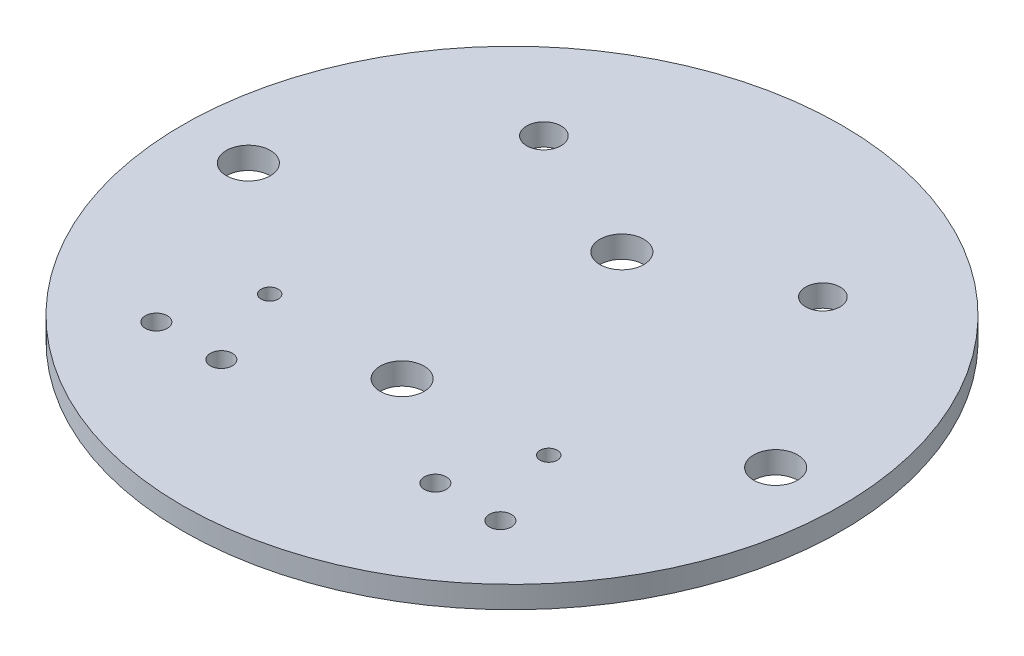
ISO-10303-21;
HEADER;
FILE_DESCRIPTION(('STEP AP214'),'2;1');
FILE_NAME('part.step','',(''),(''),'','','');
FILE_SCHEMA(('AUTOMOTIVE_DESIGN { 1 0 10303 214 1 1 1 1 }'));
ENDSEC;
DATA;
#1=APPLICATION_CONTEXT('core data for automotive mechanical design processes');
#2=APPLICATION_PROTOCOL_DEFINITION('international standard','automotive_design',2000,#1);
#3=PRODUCT_CONTEXT('',#1,'mechanical');
#4=PRODUCT('Part','Part','',(#3));
#5=PRODUCT_RELATED_PRODUCT_CATEGORY('part','',(#4));
#6=PRODUCT_DEFINITION_FORMATION('','',#4);
#7=PRODUCT_DEFINITION_CONTEXT('part definition',#1,'design');
#8=PRODUCT_DEFINITION('design','',#6,#7);
#9=PRODUCT_DEFINITION_SHAPE('','',#8);
#10=(LENGTH_UNIT() NAMED_UNIT(*) SI_UNIT(.MILLI.,.METRE.));
#11=(NAMED_UNIT(*) PLANE_ANGLE_UNIT() SI_UNIT($,.RADIAN.));
#12=(NAMED_UNIT(*) SI_UNIT($,.STERADIAN.) SOLID_ANGLE_UNIT());
#13=UNCERTAINTY_MEASURE_WITH_UNIT(LENGTH_MEASURE(1.E-05),#10,'distance_accuracy_value','');
#14=(GEOMETRIC_REPRESENTATION_CONTEXT(3) GLOBAL_UNCERTAINTY_ASSIGNED_CONTEXT((#13)) GLOBAL_UNIT_ASSIGNED_CONTEXT((#10,
#11,#12)) REPRESENTATION_CONTEXT('',''));
#15=CARTESIAN_POINT('',(0.,0.,0.));
#16=DIRECTION('',(0.,0.,1.));
#17=DIRECTION('',(1.,0.,0.));
#18=AXIS2_PLACEMENT_3D('',#15,#16,#17);
#19=CARTESIAN_POINT('',(0.,3.175,0.));
#20=DIRECTION('',(0.,-1.,0.));
#21=DIRECTION('',(0.,0.,-1.));
#22=AXIS2_PLACEMENT_3D('',#19,#20,#21);
#23=CYLINDRICAL_SURFACE('',#22,47.625);
#24=CARTESIAN_POINT('',(0.,3.175,0.));
#25=DIRECTION('',(0.,1.,0.));
#26=DIRECTION('',(0.,0.,1.));
#27=AXIS2_PLACEMENT_3D('',#24,#25,#26);
#28=CIRCLE('',#27,47.625);
#29=CARTESIAN_POINT('',(0.,3.175,47.625));
#30=VERTEX_POINT('',#29);
#31=EDGE_CURVE('E10',#30,#30,#28,.T.);
#32=ORIENTED_EDGE('',*,*,#31,.F.);
#33=EDGE_LOOP('',(#32));
#34=FACE_BOUND('',#33,.T.);
#35=CARTESIAN_POINT('',(0.,0.,0.));
#36=DIRECTION('',(0.,1.,0.));
#37=DIRECTION('',(0.,0.,1.));
#38=AXIS2_PLACEMENT_3D('',#35,#36,#37);
#39=CIRCLE('',#38,47.625);
#40=CARTESIAN_POINT('',(0.,0.,47.625));
#41=VERTEX_POINT('',#40);
#42=EDGE_CURVE('E37',#41,#41,#39,.T.);
#43=ORIENTED_EDGE('',*,*,#42,.T.);
#44=EDGE_LOOP('',(#43));
#45=FACE_BOUND('',#44,.T.);
#46=ADVANCED_FACE('F30',(#34,#45),#23,.T.);
#47=CARTESIAN_POINT('',(0.,3.175,0.));
#48=DIRECTION('',(0.,1.,0.));
#49=DIRECTION('',(0.,0.,1.));
#50=AXIS2_PLACEMENT_3D('',#47,#48,#49);
#51=PLANE('',#50);
#52=CARTESIAN_POINT('',(-20.16125,3.175,-24.765));
#53=DIRECTION('',(0.,1.,0.));
#54=DIRECTION('',(0.,0.,1.));
#55=AXIS2_PLACEMENT_3D('',#52,#53,#54);
#56=CIRCLE('',#55,2.4892);
#57=CARTESIAN_POINT('',(-20.16125,3.175,-22.2758));
#58=VERTEX_POINT('',#57);
#59=EDGE_CURVE('E87',#58,#58,#56,.T.);
#60=ORIENTED_EDGE('',*,*,#59,.F.);
#61=EDGE_LOOP('',(#60));
#62=FACE_BOUND('',#61,.T.);
#63=CARTESIAN_POINT('',(20.16125,3.175,-24.765));
#64=DIRECTION('',(0.,1.,0.));
#65=DIRECTION('',(0.,0.,1.));
#66=AXIS2_PLACEMENT_3D('',#63,#64,#65);
#67=CIRCLE('',#66,2.4892);
#68=CARTESIAN_POINT('',(20.16125,3.175,-22.2758));
#69=VERTEX_POINT('',#68);
#70=EDGE_CURVE('E92',#69,#69,#67,.T.);
#71=ORIENTED_EDGE('',*,*,#70,.F.);
#72=EDGE_LOOP('',(#71));
#73=FACE_BOUND('',#72,.T.);
#74=CARTESIAN_POINT('',(-24.86025,3.175,26.5429999999999));
#75=DIRECTION('',(0.,1.,0.));
#76=DIRECTION('',(0.,0.,1.));
#77=AXIS2_PLACEMENT_3D('',#74,#75,#76);
#78=CIRCLE('',#77,1.5875);
#79=CARTESIAN_POINT('',(-24.86025,3.175,28.1304999999999));
#80=VERTEX_POINT('',#79);
#81=EDGE_CURVE('E59',#80,#80,#78,.T.);
#82=ORIENTED_EDGE('',*,*,#81,.F.);
#83=EDGE_LOOP('',(#82));
#84=FACE_BOUND('',#83,.T.);
#85=CARTESIAN_POINT('',(-15.46225,3.175,26.5429999999999));
#86=DIRECTION('',(0.,1.,0.));
#87=DIRECTION('',(0.,0.,1.));
#88=AXIS2_PLACEMENT_3D('',#85,#86,#87);
#89=CIRCLE('',#88,1.5875);
#90=CARTESIAN_POINT('',(-15.46225,3.175,28.1304999999999));
#91=VERTEX_POINT('',#90);
#92=EDGE_CURVE('E82',#91,#91,#89,.T.);
#93=ORIENTED_EDGE('',*,*,#92,.F.);
#94=EDGE_LOOP('',(#93));
#95=FACE_BOUND('',#94,.T.);
#96=CARTESIAN_POINT('',(15.46225,3.175,26.5429999999999));
#97=DIRECTION('',(0.,1.,0.));
#98=DIRECTION('',(0.,0.,1.));
#99=AXIS2_PLACEMENT_3D('',#96,#97,#98);
#100=CIRCLE('',#99,1.5875);
#101=CARTESIAN_POINT('',(15.46225,3.175,28.1304999999999));
#102=VERTEX_POINT('',#101);
#103=EDGE_CURVE('E78',#102,#102,#100,.T.);
#104=ORIENTED_EDGE('',*,*,#103,.F.);
#105=EDGE_LOOP('',(#104));
#106=FACE_BOUND('',#105,.T.);
#107=CARTESIAN_POINT('',(24.86025,3.175,26.5429999999999));
#108=DIRECTION('',(0.,1.,0.));
#109=DIRECTION('',(0.,0.,1.));
#110=AXIS2_PLACEMENT_3D('',#107,#108,#109);
#111=CIRCLE('',#110,1.5875);
#112=CARTESIAN_POINT('',(24.86025,3.175,28.1304999999999));
#113=VERTEX_POINT('',#112);
#114=EDGE_CURVE('E74',#113,#113,#111,.T.);
#115=ORIENTED_EDGE('',*,*,#114,.F.);
#116=EDGE_LOOP('',(#115));
#117=FACE_BOUND('',#116,.T.);
#118=CARTESIAN_POINT('',(20.16125,3.175,14.859));
#119=DIRECTION('',(0.,1.,0.));
#120=DIRECTION('',(0.,0.,1.));
#121=AXIS2_PLACEMENT_3D('',#118,#119,#120);
#122=CIRCLE('',#121,1.25);
#123=CARTESIAN_POINT('',(20.16125,3.175,16.109));
#124=VERTEX_POINT('',#123);
#125=EDGE_CURVE('E70',#124,#124,#122,.T.);
#126=ORIENTED_EDGE('',*,*,#125,.F.);
#127=EDGE_LOOP('',(#126));
#128=FACE_BOUND('',#127,.T.);
#129=CARTESIAN_POINT('',(-20.16125,3.175,14.8589999999999));
#130=DIRECTION('',(0.,1.,0.));
#131=DIRECTION('',(0.,0.,1.));
#132=AXIS2_PLACEMENT_3D('',#129,#130,#131);
#133=CIRCLE('',#132,1.25);
#134=CARTESIAN_POINT('',(-20.16125,3.175,16.1089999999999));
#135=VERTEX_POINT('',#134);
#136=EDGE_CURVE('E66',#135,#135,#133,.T.);
#137=ORIENTED_EDGE('',*,*,#136,.F.);
#138=EDGE_LOOP('',(#137));
#139=FACE_BOUND('',#138,.T.);
#140=CARTESIAN_POINT('',(0.,3.175,15.875));
#141=DIRECTION('',(0.,1.,0.));
#142=DIRECTION('',(0.,0.,1.));
#143=AXIS2_PLACEMENT_3D('',#140,#141,#142);
#144=CIRCLE('',#143,3.175);
#145=CARTESIAN_POINT('',(0.,3.175,19.05));
#146=VERTEX_POINT('',#145);
#147=EDGE_CURVE('E51',#146,#146,#144,.T.);
#148=ORIENTED_EDGE('',*,*,#147,.F.);
#149=EDGE_LOOP('',(#148));
#150=FACE_BOUND('',#149,.T.);
#151=CARTESIAN_POINT('',(0.,3.175,-15.875));
#152=DIRECTION('',(0.,1.,0.));
#153=DIRECTION('',(0.,0.,1.));
#154=AXIS2_PLACEMENT_3D('',#151,#152,#153);
#155=CIRCLE('',#154,3.175);
#156=CARTESIAN_POINT('',(0.,3.175,-12.7));
#157=VERTEX_POINT('',#156);
#158=EDGE_CURVE('E58',#157,#157,#155,.T.);
#159=ORIENTED_EDGE('',*,*,#158,.F.);
#160=EDGE_LOOP('',(#159));
#161=FACE_BOUND('',#160,.T.);
#162=CARTESIAN_POINT('',(38.1,3.175,0.));
#163=DIRECTION('',(0.,1.,0.));
#164=DIRECTION('',(0.,0.,1.));
#165=AXIS2_PLACEMENT_3D('',#162,#163,#164);
#166=CIRCLE('',#165,3.175);
#167=CARTESIAN_POINT('',(38.1,3.175,3.17499999999998));
#168=VERTEX_POINT('',#167);
#169=EDGE_CURVE('E42',#168,#168,#166,.T.);
#170=ORIENTED_EDGE('',*,*,#169,.F.);
#171=EDGE_LOOP('',(#170));
#172=FACE_BOUND('',#171,.T.);
#173=CARTESIAN_POINT('',(-38.1,3.175,0.));
#174=DIRECTION('',(0.,1.,0.));
#175=DIRECTION('',(0.,0.,1.));
#176=AXIS2_PLACEMENT_3D('',#173,#174,#175);
#177=CIRCLE('',#176,3.175);
#178=CARTESIAN_POINT('',(-38.1,3.175,3.17500000000001));
#179=VERTEX_POINT('',#178);
#180=EDGE_CURVE('E50',#179,#179,#177,.T.);
#181=ORIENTED_EDGE('',*,*,#180,.F.);
#182=EDGE_LOOP('',(#181));
#183=FACE_BOUND('',#182,.T.);
#184=ORIENTED_EDGE('',*,*,#31,.T.);
#185=EDGE_LOOP('',(#184));
#186=FACE_BOUND('',#185,.T.);
#187=ADVANCED_FACE('F120',(#62,#73,#84,#95,#106,#117,#128,#139,#150,#161,#172,#183,#186),#51,.T.);
#188=CARTESIAN_POINT('',(0.,0.,0.));
#189=DIRECTION('',(0.,1.,0.));
#190=DIRECTION('',(0.,0.,1.));
#191=AXIS2_PLACEMENT_3D('',#188,#189,#190);
#192=PLANE('',#191);
#193=CARTESIAN_POINT('',(-20.16125,0.,-24.765));
#194=DIRECTION('',(0.,1.,0.));
#195=DIRECTION('',(0.,0.,1.));
#196=AXIS2_PLACEMENT_3D('',#193,#194,#195);
#197=CIRCLE('',#196,2.4892);
#198=CARTESIAN_POINT('',(-20.16125,0.,-22.2758));
#199=VERTEX_POINT('',#198);
#200=EDGE_CURVE('E33',#199,#199,#197,.T.);
#201=ORIENTED_EDGE('',*,*,#200,.T.);
#202=EDGE_LOOP('',(#201));
#203=FACE_BOUND('',#202,.T.);
#204=CARTESIAN_POINT('',(20.16125,0.,-24.765));
#205=DIRECTION('',(0.,1.,0.));
#206=DIRECTION('',(0.,0.,1.));
#207=AXIS2_PLACEMENT_3D('',#204,#205,#206);
#208=CIRCLE('',#207,2.4892);
#209=CARTESIAN_POINT('',(20.16125,0.,-22.2758));
#210=VERTEX_POINT('',#209);
#211=EDGE_CURVE('E85',#210,#210,#208,.T.);
#212=ORIENTED_EDGE('',*,*,#211,.T.);
#213=EDGE_LOOP('',(#212));
#214=FACE_BOUND('',#213,.T.);
#215=CARTESIAN_POINT('',(-24.86025,0.,26.5429999999999));
#216=DIRECTION('',(0.,1.,0.));
#217=DIRECTION('',(0.,0.,1.));
#218=AXIS2_PLACEMENT_3D('',#215,#216,#217);
#219=CIRCLE('',#218,1.5875);
#220=CARTESIAN_POINT('',(-24.86025,0.,28.1304999999999));
#221=VERTEX_POINT('',#220);
#222=EDGE_CURVE('E83',#221,#221,#219,.T.);
#223=ORIENTED_EDGE('',*,*,#222,.T.);
#224=EDGE_LOOP('',(#223));
#225=FACE_BOUND('',#224,.T.);
#226=CARTESIAN_POINT('',(-15.46225,0.,26.5429999999999));
#227=DIRECTION('',(0.,1.,0.));
#228=DIRECTION('',(0.,0.,1.));
#229=AXIS2_PLACEMENT_3D('',#226,#227,#228);
#230=CIRCLE('',#229,1.5875);
#231=CARTESIAN_POINT('',(-15.46225,0.,28.1304999999999));
#232=VERTEX_POINT('',#231);
#233=EDGE_CURVE('E79',#232,#232,#230,.T.);
#234=ORIENTED_EDGE('',*,*,#233,.T.);
#235=EDGE_LOOP('',(#234));
#236=FACE_BOUND('',#235,.T.);
#237=CARTESIAN_POINT('',(15.46225,0.,26.5429999999999));
#238=DIRECTION('',(0.,1.,0.));
#239=DIRECTION('',(0.,0.,1.));
#240=AXIS2_PLACEMENT_3D('',#237,#238,#239);
#241=CIRCLE('',#240,1.5875);
#242=CARTESIAN_POINT('',(15.46225,0.,28.1304999999999));
#243=VERTEX_POINT('',#242);
#244=EDGE_CURVE('E75',#243,#243,#241,.T.);
#245=ORIENTED_EDGE('',*,*,#244,.T.);
#246=EDGE_LOOP('',(#245));
#247=FACE_BOUND('',#246,.T.);
#248=CARTESIAN_POINT('',(24.86025,0.,26.5429999999999));
#249=DIRECTION('',(0.,1.,0.));
#250=DIRECTION('',(0.,0.,1.));
#251=AXIS2_PLACEMENT_3D('',#248,#249,#250);
#252=CIRCLE('',#251,1.5875);
#253=CARTESIAN_POINT('',(24.86025,0.,28.1304999999999));
#254=VERTEX_POINT('',#253);
#255=EDGE_CURVE('E71',#254,#254,#252,.T.);
#256=ORIENTED_EDGE('',*,*,#255,.T.);
#257=EDGE_LOOP('',(#256));
#258=FACE_BOUND('',#257,.T.);
#259=CARTESIAN_POINT('',(20.16125,0.,14.859));
#260=DIRECTION('',(0.,1.,0.));
#261=DIRECTION('',(0.,0.,1.));
#262=AXIS2_PLACEMENT_3D('',#259,#260,#261);
#263=CIRCLE('',#262,1.25);
#264=CARTESIAN_POINT('',(20.16125,0.,16.109));
#265=VERTEX_POINT('',#264);
#266=EDGE_CURVE('E67',#265,#265,#263,.T.);
#267=ORIENTED_EDGE('',*,*,#266,.T.);
#268=EDGE_LOOP('',(#267));
#269=FACE_BOUND('',#268,.T.);
#270=CARTESIAN_POINT('',(-20.16125,0.,14.8589999999999));
#271=DIRECTION('',(0.,1.,0.));
#272=DIRECTION('',(0.,0.,1.));
#273=AXIS2_PLACEMENT_3D('',#270,#271,#272);
#274=CIRCLE('',#273,1.25);
#275=CARTESIAN_POINT('',(-20.16125,0.,16.1089999999999));
#276=VERTEX_POINT('',#275);
#277=EDGE_CURVE('E63',#276,#276,#274,.T.);
#278=ORIENTED_EDGE('',*,*,#277,.T.);
#279=EDGE_LOOP('',(#278));
#280=FACE_BOUND('',#279,.T.);
#281=CARTESIAN_POINT('',(0.,0.,15.875));
#282=DIRECTION('',(0.,1.,0.));
#283=DIRECTION('',(0.,0.,1.));
#284=AXIS2_PLACEMENT_3D('',#281,#282,#283);
#285=CIRCLE('',#284,3.175);
#286=CARTESIAN_POINT('',(0.,0.,19.05));
#287=VERTEX_POINT('',#286);
#288=EDGE_CURVE('E60',#287,#287,#285,.T.);
#289=ORIENTED_EDGE('',*,*,#288,.T.);
#290=EDGE_LOOP('',(#289));
#291=FACE_BOUND('',#290,.T.);
#292=CARTESIAN_POINT('',(0.,0.,-15.875));
#293=DIRECTION('',(0.,1.,0.));
#294=DIRECTION('',(0.,0.,1.));
#295=AXIS2_PLACEMENT_3D('',#292,#293,#294);
#296=CIRCLE('',#295,3.175);
#297=CARTESIAN_POINT('',(0.,0.,-12.7));
#298=VERTEX_POINT('',#297);
#299=EDGE_CURVE('E55',#298,#298,#296,.T.);
#300=ORIENTED_EDGE('',*,*,#299,.T.);
#301=EDGE_LOOP('',(#300));
#302=FACE_BOUND('',#301,.T.);
#303=CARTESIAN_POINT('',(38.1,0.,0.));
#304=DIRECTION('',(0.,1.,0.));
#305=DIRECTION('',(0.,0.,1.));
#306=AXIS2_PLACEMENT_3D('',#303,#304,#305);
#307=CIRCLE('',#306,3.175);
#308=CARTESIAN_POINT('',(38.1,0.,3.17499999999998));
#309=VERTEX_POINT('',#308);
#310=EDGE_CURVE('E52',#309,#309,#307,.T.);
#311=ORIENTED_EDGE('',*,*,#310,.T.);
#312=EDGE_LOOP('',(#311));
#313=FACE_BOUND('',#312,.T.);
#314=CARTESIAN_POINT('',(-38.1,0.,0.));
#315=DIRECTION('',(0.,1.,0.));
#316=DIRECTION('',(0.,0.,1.));
#317=AXIS2_PLACEMENT_3D('',#314,#315,#316);
#318=CIRCLE('',#317,3.175);
#319=CARTESIAN_POINT('',(-38.1,0.,3.17500000000001));
#320=VERTEX_POINT('',#319);
#321=EDGE_CURVE('E47',#320,#320,#318,.T.);
#322=ORIENTED_EDGE('',*,*,#321,.T.);
#323=EDGE_LOOP('',(#322));
#324=FACE_BOUND('',#323,.T.);
#325=ORIENTED_EDGE('',*,*,#42,.F.);
#326=EDGE_LOOP('',(#325));
#327=FACE_BOUND('',#326,.T.);
#328=ADVANCED_FACE('F122',(#203,#214,#225,#236,#247,#258,#269,#280,#291,#302,#313,#324,#327),
#192,.F.);
#329=CARTESIAN_POINT('',(-38.1,-31.623,0.));
#330=DIRECTION('',(0.,1.,0.));
#331=DIRECTION('',(0.,0.,1.));
#332=AXIS2_PLACEMENT_3D('',#329,#330,#331);
#333=CYLINDRICAL_SURFACE('',#332,3.175);
#334=ORIENTED_EDGE('',*,*,#180,.T.);
#335=EDGE_LOOP('',(#334));
#336=FACE_BOUND('',#335,.T.);
#337=ORIENTED_EDGE('',*,*,#321,.F.);
#338=EDGE_LOOP('',(#337));
#339=FACE_BOUND('',#338,.T.);
#340=ADVANCED_FACE('F117',(#336,#339),#333,.F.);
#341=CARTESIAN_POINT('',(38.1,-31.623,0.));
#342=DIRECTION('',(0.,1.,0.));
#343=DIRECTION('',(0.,0.,1.));
#344=AXIS2_PLACEMENT_3D('',#341,#342,#343);
#345=CYLINDRICAL_SURFACE('',#344,3.175);
#346=ORIENTED_EDGE('',*,*,#169,.T.);
#347=EDGE_LOOP('',(#346));
#348=FACE_BOUND('',#347,.T.);
#349=ORIENTED_EDGE('',*,*,#310,.F.);
#350=EDGE_LOOP('',(#349));
#351=FACE_BOUND('',#350,.T.);
#352=ADVANCED_FACE('F136',(#348,#351),#345,.F.);
#353=CARTESIAN_POINT('',(0.,22.225,-15.875));
#354=DIRECTION('',(0.,-1.,0.));
#355=DIRECTION('',(0.,0.,-1.));
#356=AXIS2_PLACEMENT_3D('',#353,#354,#355);
#357=CYLINDRICAL_SURFACE('',#356,3.175);
#358=ORIENTED_EDGE('',*,*,#158,.T.);
#359=EDGE_LOOP('',(#358));
#360=FACE_BOUND('',#359,.T.);
#361=ORIENTED_EDGE('',*,*,#299,.F.);
#362=EDGE_LOOP('',(#361));
#363=FACE_BOUND('',#362,.T.);
#364=ADVANCED_FACE('F139',(#360,#363),#357,.F.);
#365=CARTESIAN_POINT('',(0.,22.225,15.875));
#366=DIRECTION('',(0.,-1.,0.));
#367=DIRECTION('',(0.,0.,-1.));
#368=AXIS2_PLACEMENT_3D('',#365,#366,#367);
#369=CYLINDRICAL_SURFACE('',#368,3.175);
#370=ORIENTED_EDGE('',*,*,#147,.T.);
#371=EDGE_LOOP('',(#370));
#372=FACE_BOUND('',#371,.T.);
#373=ORIENTED_EDGE('',*,*,#288,.F.);
#374=EDGE_LOOP('',(#373));
#375=FACE_BOUND('',#374,.T.);
#376=ADVANCED_FACE('F143',(#372,#375),#369,.F.);
#377=CARTESIAN_POINT('',(-20.16125,47.625,14.8589999999999));
#378=DIRECTION('',(0.,-1.,0.));
#379=DIRECTION('',(0.,0.,-1.));
#380=AXIS2_PLACEMENT_3D('',#377,#378,#379);
#381=CYLINDRICAL_SURFACE('',#380,1.25);
#382=ORIENTED_EDGE('',*,*,#136,.T.);
#383=EDGE_LOOP('',(#382));
#384=FACE_BOUND('',#383,.T.);
#385=ORIENTED_EDGE('',*,*,#277,.F.);
#386=EDGE_LOOP('',(#385));
#387=FACE_BOUND('',#386,.T.);
#388=ADVANCED_FACE('F147',(#384,#387),#381,.F.);
#389=CARTESIAN_POINT('',(20.16125,47.625,14.859));
#390=DIRECTION('',(0.,-1.,0.));
#391=DIRECTION('',(0.,0.,-1.));
#392=AXIS2_PLACEMENT_3D('',#389,#390,#391);
#393=CYLINDRICAL_SURFACE('',#392,1.25);
#394=ORIENTED_EDGE('',*,*,#125,.T.);
#395=EDGE_LOOP('',(#394));
#396=FACE_BOUND('',#395,.T.);
#397=ORIENTED_EDGE('',*,*,#266,.F.);
#398=EDGE_LOOP('',(#397));
#399=FACE_BOUND('',#398,.T.);
#400=ADVANCED_FACE('F151',(#396,#399),#393,.F.);
#401=CARTESIAN_POINT('',(24.86025,47.625,26.5429999999999));
#402=DIRECTION('',(0.,-1.,0.));
#403=DIRECTION('',(0.,0.,-1.));
#404=AXIS2_PLACEMENT_3D('',#401,#402,#403);
#405=CYLINDRICAL_SURFACE('',#404,1.5875);
#406=ORIENTED_EDGE('',*,*,#114,.T.);
#407=EDGE_LOOP('',(#406));
#408=FACE_BOUND('',#407,.T.);
#409=ORIENTED_EDGE('',*,*,#255,.F.);
#410=EDGE_LOOP('',(#409));
#411=FACE_BOUND('',#410,.T.);
#412=ADVANCED_FACE('F155',(#408,#411),#405,.F.);
#413=CARTESIAN_POINT('',(15.46225,47.625,26.5429999999999));
#414=DIRECTION('',(0.,-1.,0.));
#415=DIRECTION('',(0.,0.,-1.));
#416=AXIS2_PLACEMENT_3D('',#413,#414,#415);
#417=CYLINDRICAL_SURFACE('',#416,1.5875);
#418=ORIENTED_EDGE('',*,*,#103,.T.);
#419=EDGE_LOOP('',(#418));
#420=FACE_BOUND('',#419,.T.);
#421=ORIENTED_EDGE('',*,*,#244,.F.);
#422=EDGE_LOOP('',(#421));
#423=FACE_BOUND('',#422,.T.);
#424=ADVANCED_FACE('F159',(#420,#423),#417,.F.);
#425=CARTESIAN_POINT('',(-15.46225,47.625,26.5429999999999));
#426=DIRECTION('',(0.,-1.,0.));
#427=DIRECTION('',(0.,0.,-1.));
#428=AXIS2_PLACEMENT_3D('',#425,#426,#427);
#429=CYLINDRICAL_SURFACE('',#428,1.5875);
#430=ORIENTED_EDGE('',*,*,#92,.T.);
#431=EDGE_LOOP('',(#430));
#432=FACE_BOUND('',#431,.T.);
#433=ORIENTED_EDGE('',*,*,#233,.F.);
#434=EDGE_LOOP('',(#433));
#435=FACE_BOUND('',#434,.T.);
#436=ADVANCED_FACE('F163',(#432,#435),#429,.F.);
#437=CARTESIAN_POINT('',(-24.86025,47.625,26.5429999999999));
#438=DIRECTION('',(0.,-1.,0.));
#439=DIRECTION('',(0.,0.,-1.));
#440=AXIS2_PLACEMENT_3D('',#437,#438,#439);
#441=CYLINDRICAL_SURFACE('',#440,1.5875);
#442=ORIENTED_EDGE('',*,*,#81,.T.);
#443=EDGE_LOOP('',(#442));
#444=FACE_BOUND('',#443,.T.);
#445=ORIENTED_EDGE('',*,*,#222,.F.);
#446=EDGE_LOOP('',(#445));
#447=FACE_BOUND('',#446,.T.);
#448=ADVANCED_FACE('F167',(#444,#447),#441,.F.);
#449=CARTESIAN_POINT('',(20.16125,-22.225,-24.765));
#450=DIRECTION('',(0.,1.,0.));
#451=DIRECTION('',(0.,0.,1.));
#452=AXIS2_PLACEMENT_3D('',#449,#450,#451);
#453=CYLINDRICAL_SURFACE('',#452,2.4892);
#454=ORIENTED_EDGE('',*,*,#70,.T.);
#455=EDGE_LOOP('',(#454));
#456=FACE_BOUND('',#455,.T.);
#457=ORIENTED_EDGE('',*,*,#211,.F.);
#458=EDGE_LOOP('',(#457));
#459=FACE_BOUND('',#458,.T.);
#460=ADVANCED_FACE('F171',(#456,#459),#453,.F.);
#461=CARTESIAN_POINT('',(-20.16125,-22.225,-24.765));
#462=DIRECTION('',(0.,1.,0.));
#463=DIRECTION('',(0.,0.,1.));
#464=AXIS2_PLACEMENT_3D('',#461,#462,#463);
#465=CYLINDRICAL_SURFACE('',#464,2.4892);
#466=ORIENTED_EDGE('',*,*,#59,.T.);
#467=EDGE_LOOP('',(#466));
#468=FACE_BOUND('',#467,.T.);
#469=ORIENTED_EDGE('',*,*,#200,.F.);
#470=EDGE_LOOP('',(#469));
#471=FACE_BOUND('',#470,.T.);
#472=ADVANCED_FACE('F175',(#468,#471),#465,.F.);
#473=CLOSED_SHELL('',(#46,#187,#328,#340,#352,#364,#376,#388,#400,#412,#424,#436,#448,#460,#472));
#474=MANIFOLD_SOLID_BREP('B2',#473);
#475=ADVANCED_BREP_SHAPE_REPRESENTATION('',(#18,#474),#14);
#476=SHAPE_DEFINITION_REPRESENTATION(#9,#475);
ENDSEC;
END-ISO-10303-21;
